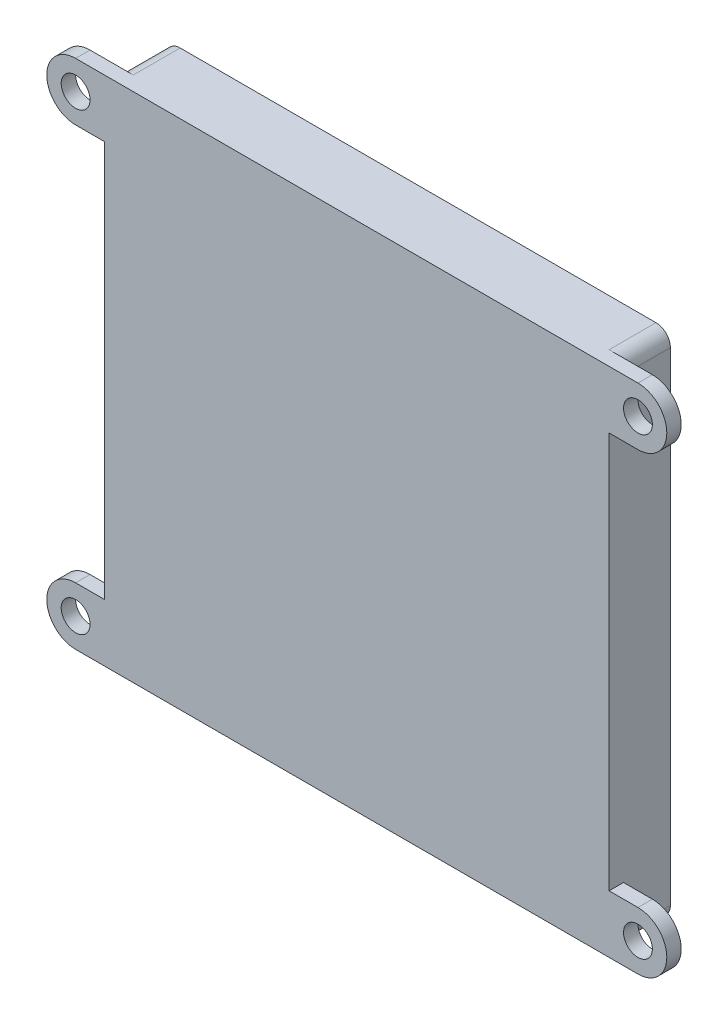
ISO-10303-21;
HEADER;
FILE_DESCRIPTION(('STEP AP214'),'2;1');
FILE_NAME('part.step','',(''),(''),'','','');
FILE_SCHEMA(('AUTOMOTIVE_DESIGN { 1 0 10303 214 1 1 1 1 }'));
ENDSEC;
DATA;
#1=APPLICATION_CONTEXT('core data for automotive mechanical design processes');
#2=APPLICATION_PROTOCOL_DEFINITION('international standard','automotive_design',2000,#1);
#3=PRODUCT_CONTEXT('',#1,'mechanical');
#4=PRODUCT('Part','Part','',(#3));
#5=PRODUCT_RELATED_PRODUCT_CATEGORY('part','',(#4));
#6=PRODUCT_DEFINITION_FORMATION('','',#4);
#7=PRODUCT_DEFINITION_CONTEXT('part definition',#1,'design');
#8=PRODUCT_DEFINITION('design','',#6,#7);
#9=PRODUCT_DEFINITION_SHAPE('','',#8);
#10=(LENGTH_UNIT() NAMED_UNIT(*) SI_UNIT(.MILLI.,.METRE.));
#11=(NAMED_UNIT(*) PLANE_ANGLE_UNIT() SI_UNIT($,.RADIAN.));
#12=(NAMED_UNIT(*) SI_UNIT($,.STERADIAN.) SOLID_ANGLE_UNIT());
#13=UNCERTAINTY_MEASURE_WITH_UNIT(LENGTH_MEASURE(1.E-05),#10,'distance_accuracy_value','');
#14=(GEOMETRIC_REPRESENTATION_CONTEXT(3) GLOBAL_UNCERTAINTY_ASSIGNED_CONTEXT((#13)) GLOBAL_UNIT_ASSIGNED_CONTEXT((#10,
#11,#12)) REPRESENTATION_CONTEXT('',''));
#15=CARTESIAN_POINT('',(0.,0.,0.));
#16=DIRECTION('',(0.,0.,1.));
#17=DIRECTION('',(1.,0.,0.));
#18=AXIS2_PLACEMENT_3D('',#15,#16,#17);
#19=CARTESIAN_POINT('',(0.,0.,0.));
#20=DIRECTION('',(0.,0.,1.));
#21=DIRECTION('',(1.,0.,0.));
#22=AXIS2_PLACEMENT_3D('',#19,#20,#21);
#23=PLANE('',#22);
#24=CARTESIAN_POINT('',(39.,-31.5,0.));
#25=DIRECTION('',(0.,0.,1.));
#26=DIRECTION('',(1.,0.,0.));
#27=AXIS2_PLACEMENT_3D('',#24,#25,#26);
#28=CIRCLE('',#27,2.);
#29=CARTESIAN_POINT('',(41.,-31.5,0.));
#30=VERTEX_POINT('',#29);
#31=EDGE_CURVE('E214',#30,#30,#28,.F.);
#32=ORIENTED_EDGE('',*,*,#31,.F.);
#33=EDGE_LOOP('',(#32));
#34=FACE_BOUND('',#33,.T.);
#35=DIRECTION('',(1.,0.,0.));
#36=VECTOR('',#35,1.);
#37=CARTESIAN_POINT('',(0.,-35.5,0.));
#38=LINE('',#37,#36);
#39=CARTESIAN_POINT('',(33.,-35.5,0.));
#40=VERTEX_POINT('',#39);
#41=CARTESIAN_POINT('',(39.,-35.5,0.));
#42=VERTEX_POINT('',#41);
#43=EDGE_CURVE('E230',#40,#42,#38,.T.);
#44=ORIENTED_EDGE('',*,*,#43,.F.);
#45=CARTESIAN_POINT('',(33.,-33.5,0.));
#46=DIRECTION('',(0.,0.,1.));
#47=DIRECTION('',(1.,0.,0.));
#48=AXIS2_PLACEMENT_3D('',#45,#46,#47);
#49=CIRCLE('',#48,2.);
#50=CARTESIAN_POINT('',(35.,-33.5,0.));
#51=VERTEX_POINT('',#50);
#52=EDGE_CURVE('E185',#40,#51,#49,.T.);
#53=ORIENTED_EDGE('',*,*,#52,.T.);
#54=DIRECTION('',(0.,1.,0.));
#55=VECTOR('',#54,1.);
#56=CARTESIAN_POINT('',(35.,35.5,0.));
#57=LINE('',#56,#55);
#58=CARTESIAN_POINT('',(35.,-27.5,0.));
#59=VERTEX_POINT('',#58);
#60=EDGE_CURVE('E179',#51,#59,#57,.T.);
#61=ORIENTED_EDGE('',*,*,#60,.T.);
#62=DIRECTION('',(1.,0.,0.));
#63=VECTOR('',#62,1.);
#64=CARTESIAN_POINT('',(0.,-27.5,0.));
#65=LINE('',#64,#63);
#66=CARTESIAN_POINT('',(39.,-27.5,0.));
#67=VERTEX_POINT('',#66);
#68=EDGE_CURVE('E183',#59,#67,#65,.T.);
#69=ORIENTED_EDGE('',*,*,#68,.T.);
#70=CARTESIAN_POINT('',(39.,-31.5,0.));
#71=DIRECTION('',(0.,0.,1.));
#72=DIRECTION('',(1.,0.,0.));
#73=AXIS2_PLACEMENT_3D('',#70,#71,#72);
#74=CIRCLE('',#73,4.);
#75=EDGE_CURVE('E208',#67,#42,#74,.F.);
#76=ORIENTED_EDGE('',*,*,#75,.T.);
#77=EDGE_LOOP('',(#44,#53,#61,#69,#76));
#78=FACE_BOUND('',#77,.T.);
#79=ADVANCED_FACE('F41',(#34,#78),#23,.F.);
#80=CARTESIAN_POINT('',(39.,31.5,0.));
#81=DIRECTION('',(0.,0.,1.));
#82=DIRECTION('',(1.,0.,0.));
#83=AXIS2_PLACEMENT_3D('',#80,#81,#82);
#84=CIRCLE('',#83,2.);
#85=CARTESIAN_POINT('',(41.,31.5,0.));
#86=VERTEX_POINT('',#85);
#87=EDGE_CURVE('E274',#86,#86,#84,.T.);
#88=ORIENTED_EDGE('',*,*,#87,.T.);
#89=EDGE_LOOP('',(#88));
#90=FACE_BOUND('',#89,.T.);
#91=DIRECTION('',(1.,0.,0.));
#92=VECTOR('',#91,1.);
#93=CARTESIAN_POINT('',(0.,27.5,0.));
#94=LINE('',#93,#92);
#95=CARTESIAN_POINT('',(35.,27.5,0.));
#96=VERTEX_POINT('',#95);
#97=CARTESIAN_POINT('',(39.,27.5,0.));
#98=VERTEX_POINT('',#97);
#99=EDGE_CURVE('E234',#96,#98,#94,.T.);
#100=ORIENTED_EDGE('',*,*,#99,.F.);
#101=CARTESIAN_POINT('',(35.,33.5,0.));
#102=VERTEX_POINT('',#101);
#103=EDGE_CURVE('E191',#96,#102,#57,.T.);
#104=ORIENTED_EDGE('',*,*,#103,.T.);
#105=CARTESIAN_POINT('',(33.,33.5,0.));
#106=DIRECTION('',(0.,0.,1.));
#107=DIRECTION('',(1.,0.,0.));
#108=AXIS2_PLACEMENT_3D('',#105,#106,#107);
#109=CIRCLE('',#108,2.);
#110=CARTESIAN_POINT('',(33.,35.5,0.));
#111=VERTEX_POINT('',#110);
#112=EDGE_CURVE('E11',#102,#111,#109,.T.);
#113=ORIENTED_EDGE('',*,*,#112,.T.);
#114=DIRECTION('',(1.,0.,0.));
#115=VECTOR('',#114,1.);
#116=CARTESIAN_POINT('',(0.,35.5,0.));
#117=LINE('',#116,#115);
#118=CARTESIAN_POINT('',(39.,35.5,0.));
#119=VERTEX_POINT('',#118);
#120=EDGE_CURVE('E65',#111,#119,#117,.T.);
#121=ORIENTED_EDGE('',*,*,#120,.T.);
#122=CARTESIAN_POINT('',(39.,31.5,0.));
#123=DIRECTION('',(0.,0.,1.));
#124=DIRECTION('',(1.,0.,0.));
#125=AXIS2_PLACEMENT_3D('',#122,#123,#124);
#126=CIRCLE('',#125,4.);
#127=EDGE_CURVE('E244',#98,#119,#126,.T.);
#128=ORIENTED_EDGE('',*,*,#127,.F.);
#129=EDGE_LOOP('',(#100,#104,#113,#121,#128));
#130=FACE_BOUND('',#129,.T.);
#131=ADVANCED_FACE('F341',(#90,#130),#23,.F.);
#132=CARTESIAN_POINT('',(-39.,31.5,0.));
#133=DIRECTION('',(0.,0.,1.));
#134=DIRECTION('',(1.,0.,0.));
#135=AXIS2_PLACEMENT_3D('',#132,#133,#134);
#136=CIRCLE('',#135,2.);
#137=CARTESIAN_POINT('',(-37.,31.5,0.));
#138=VERTEX_POINT('',#137);
#139=EDGE_CURVE('E525',#138,#138,#136,.T.);
#140=ORIENTED_EDGE('',*,*,#139,.T.);
#141=EDGE_LOOP('',(#140));
#142=FACE_BOUND('',#141,.T.);
#143=CARTESIAN_POINT('',(-39.,35.5,0.));
#144=VERTEX_POINT('',#143);
#145=CARTESIAN_POINT('',(-33.,35.5,0.));
#146=VERTEX_POINT('',#145);
#147=EDGE_CURVE('E57',#144,#146,#117,.T.);
#148=ORIENTED_EDGE('',*,*,#147,.T.);
#149=CARTESIAN_POINT('',(-33.,33.5,0.));
#150=DIRECTION('',(0.,0.,1.));
#151=DIRECTION('',(1.,0.,0.));
#152=AXIS2_PLACEMENT_3D('',#149,#150,#151);
#153=CIRCLE('',#152,2.);
#154=CARTESIAN_POINT('',(-35.,33.5,0.));
#155=VERTEX_POINT('',#154);
#156=EDGE_CURVE('E50',#146,#155,#153,.T.);
#157=ORIENTED_EDGE('',*,*,#156,.T.);
#158=DIRECTION('',(0.,-1.,0.));
#159=VECTOR('',#158,1.);
#160=CARTESIAN_POINT('',(-35.,35.5,0.));
#161=LINE('',#160,#159);
#162=CARTESIAN_POINT('',(-35.,27.5,0.));
#163=VERTEX_POINT('',#162);
#164=EDGE_CURVE('E189',#155,#163,#161,.T.);
#165=ORIENTED_EDGE('',*,*,#164,.T.);
#166=CARTESIAN_POINT('',(-39.,27.5,0.));
#167=VERTEX_POINT('',#166);
#168=EDGE_CURVE('E223',#167,#163,#94,.T.);
#169=ORIENTED_EDGE('',*,*,#168,.F.);
#170=CARTESIAN_POINT('',(-39.,31.5,0.));
#171=DIRECTION('',(0.,0.,1.));
#172=DIRECTION('',(1.,0.,0.));
#173=AXIS2_PLACEMENT_3D('',#170,#171,#172);
#174=CIRCLE('',#173,4.);
#175=EDGE_CURVE('E232',#144,#167,#174,.T.);
#176=ORIENTED_EDGE('',*,*,#175,.F.);
#177=EDGE_LOOP('',(#148,#157,#165,#169,#176));
#178=FACE_BOUND('',#177,.T.);
#179=ADVANCED_FACE('F336',(#142,#178),#23,.F.);
#180=CARTESIAN_POINT('',(35.,0.,2.));
#181=DIRECTION('',(1.,0.,0.));
#182=DIRECTION('',(0.,0.,-1.));
#183=AXIS2_PLACEMENT_3D('',#180,#181,#182);
#184=PLANE('',#183);
#185=ORIENTED_EDGE('',*,*,#60,.F.);
#186=DIRECTION('',(0.,0.,1.));
#187=VECTOR('',#186,1.);
#188=CARTESIAN_POINT('',(35.,-33.5,-6.5));
#189=LINE('',#188,#187);
#190=CARTESIAN_POINT('',(35.,-33.5,-6.5));
#191=VERTEX_POINT('',#190);
#192=EDGE_CURVE('E429',#51,#191,#189,.F.);
#193=ORIENTED_EDGE('',*,*,#192,.T.);
#194=DIRECTION('',(0.,1.,0.));
#195=VECTOR('',#194,1.);
#196=CARTESIAN_POINT('',(35.,35.5,-6.5));
#197=LINE('',#196,#195);
#198=CARTESIAN_POINT('',(35.,33.5,-6.5));
#199=VERTEX_POINT('',#198);
#200=EDGE_CURVE('E269',#191,#199,#197,.T.);
#201=ORIENTED_EDGE('',*,*,#200,.T.);
#202=DIRECTION('',(0.,0.,1.));
#203=VECTOR('',#202,1.);
#204=CARTESIAN_POINT('',(35.,33.5,2.));
#205=LINE('',#204,#203);
#206=EDGE_CURVE('E487',#199,#102,#205,.T.);
#207=ORIENTED_EDGE('',*,*,#206,.T.);
#208=ORIENTED_EDGE('',*,*,#103,.F.);
#209=DIRECTION('',(0.,0.,-1.));
#210=VECTOR('',#209,1.);
#211=CARTESIAN_POINT('',(35.,27.5,2.));
#212=LINE('',#211,#210);
#213=CARTESIAN_POINT('',(35.,27.5,2.));
#214=VERTEX_POINT('',#213);
#215=EDGE_CURVE('E478',#214,#96,#212,.T.);
#216=ORIENTED_EDGE('',*,*,#215,.F.);
#217=DIRECTION('',(0.,-1.,0.));
#218=VECTOR('',#217,1.);
#219=CARTESIAN_POINT('',(35.,0.,2.));
#220=LINE('',#219,#218);
#221=CARTESIAN_POINT('',(35.,-27.5,2.));
#222=VERTEX_POINT('',#221);
#223=EDGE_CURVE('E196',#214,#222,#220,.T.);
#224=ORIENTED_EDGE('',*,*,#223,.T.);
#225=DIRECTION('',(0.,0.,-1.));
#226=VECTOR('',#225,1.);
#227=CARTESIAN_POINT('',(35.,-27.5,2.));
#228=LINE('',#227,#226);
#229=EDGE_CURVE('E193',#222,#59,#228,.T.);
#230=ORIENTED_EDGE('',*,*,#229,.T.);
#231=EDGE_LOOP('',(#185,#193,#201,#207,#208,#216,#224,#230));
#232=FACE_BOUND('',#231,.T.);
#233=ADVANCED_FACE('F194',(#232),#184,.T.);
#234=CARTESIAN_POINT('',(0.,27.5,2.));
#235=DIRECTION('',(0.,1.,0.));
#236=DIRECTION('',(-1.,0.,0.));
#237=AXIS2_PLACEMENT_3D('',#234,#235,#236);
#238=PLANE('',#237);
#239=ORIENTED_EDGE('',*,*,#99,.T.);
#240=DIRECTION('',(0.,0.,-1.));
#241=VECTOR('',#240,1.);
#242=CARTESIAN_POINT('',(39.,27.5,2.));
#243=LINE('',#242,#241);
#244=CARTESIAN_POINT('',(39.,27.5,2.));
#245=VERTEX_POINT('',#244);
#246=EDGE_CURVE('E475',#245,#98,#243,.T.);
#247=ORIENTED_EDGE('',*,*,#246,.F.);
#248=DIRECTION('',(1.,0.,0.));
#249=VECTOR('',#248,1.);
#250=CARTESIAN_POINT('',(0.,27.5,2.));
#251=LINE('',#250,#249);
#252=EDGE_CURVE('E273',#214,#245,#251,.T.);
#253=ORIENTED_EDGE('',*,*,#252,.F.);
#254=ORIENTED_EDGE('',*,*,#215,.T.);
#255=EDGE_LOOP('',(#239,#247,#253,#254));
#256=FACE_BOUND('',#255,.T.);
#257=ADVANCED_FACE('F383',(#256),#238,.F.);
#258=CARTESIAN_POINT('',(39.,31.5,2.));
#259=DIRECTION('',(0.,0.,-1.));
#260=DIRECTION('',(-1.,0.,0.));
#261=AXIS2_PLACEMENT_3D('',#258,#259,#260);
#262=CYLINDRICAL_SURFACE('',#261,4.);
#263=ORIENTED_EDGE('',*,*,#127,.T.);
#264=DIRECTION('',(0.,0.,-1.));
#265=VECTOR('',#264,1.);
#266=CARTESIAN_POINT('',(39.,35.5,2.));
#267=LINE('',#266,#265);
#268=CARTESIAN_POINT('',(39.,35.5,2.));
#269=VERTEX_POINT('',#268);
#270=EDGE_CURVE('E472',#269,#119,#267,.T.);
#271=ORIENTED_EDGE('',*,*,#270,.F.);
#272=CARTESIAN_POINT('',(39.,31.5,2.));
#273=DIRECTION('',(0.,0.,1.));
#274=DIRECTION('',(1.,0.,0.));
#275=AXIS2_PLACEMENT_3D('',#272,#273,#274);
#276=CIRCLE('',#275,4.);
#277=EDGE_CURVE('E277',#245,#269,#276,.T.);
#278=ORIENTED_EDGE('',*,*,#277,.F.);
#279=ORIENTED_EDGE('',*,*,#246,.T.);
#280=EDGE_LOOP('',(#263,#271,#278,#279));
#281=FACE_BOUND('',#280,.T.);
#282=ADVANCED_FACE('F390',(#281),#262,.T.);
#283=CARTESIAN_POINT('',(0.,35.5,2.));
#284=DIRECTION('',(0.,1.,0.));
#285=DIRECTION('',(-1.,0.,0.));
#286=AXIS2_PLACEMENT_3D('',#283,#284,#285);
#287=PLANE('',#286);
#288=DIRECTION('',(-1.,0.,0.));
#289=VECTOR('',#288,1.);
#290=CARTESIAN_POINT('',(-35.,35.5,-6.5));
#291=LINE('',#290,#289);
#292=CARTESIAN_POINT('',(33.,35.5,-6.5));
#293=VERTEX_POINT('',#292);
#294=CARTESIAN_POINT('',(-33.,35.5,-6.5));
#295=VERTEX_POINT('',#294);
#296=EDGE_CURVE('E263',#293,#295,#291,.T.);
#297=ORIENTED_EDGE('',*,*,#296,.T.);
#298=DIRECTION('',(0.,0.,1.));
#299=VECTOR('',#298,1.);
#300=CARTESIAN_POINT('',(-33.,35.5,0.));
#301=LINE('',#300,#299);
#302=EDGE_CURVE('E416',#295,#146,#301,.T.);
#303=ORIENTED_EDGE('',*,*,#302,.T.);
#304=ORIENTED_EDGE('',*,*,#147,.F.);
#305=DIRECTION('',(0.,0.,-1.));
#306=VECTOR('',#305,1.);
#307=CARTESIAN_POINT('',(-39.,35.5,2.));
#308=LINE('',#307,#306);
#309=CARTESIAN_POINT('',(-39.,35.5,2.));
#310=VERTEX_POINT('',#309);
#311=EDGE_CURVE('E463',#310,#144,#308,.T.);
#312=ORIENTED_EDGE('',*,*,#311,.F.);
#313=DIRECTION('',(1.,0.,0.));
#314=VECTOR('',#313,1.);
#315=CARTESIAN_POINT('',(0.,35.5,2.));
#316=LINE('',#315,#314);
#317=EDGE_CURVE('E281',#310,#269,#316,.T.);
#318=ORIENTED_EDGE('',*,*,#317,.T.);
#319=ORIENTED_EDGE('',*,*,#270,.T.);
#320=ORIENTED_EDGE('',*,*,#120,.F.);
#321=DIRECTION('',(0.,0.,1.));
#322=VECTOR('',#321,1.);
#323=CARTESIAN_POINT('',(33.,35.5,2.));
#324=LINE('',#323,#322);
#325=EDGE_CURVE('E441',#111,#293,#324,.F.);
#326=ORIENTED_EDGE('',*,*,#325,.T.);
#327=EDGE_LOOP('',(#297,#303,#304,#312,#318,#319,#320,#326));
#328=FACE_BOUND('',#327,.T.);
#329=ADVANCED_FACE('F386',(#328),#287,.T.);
#330=CARTESIAN_POINT('',(-39.,31.5,2.));
#331=DIRECTION('',(0.,0.,-1.));
#332=DIRECTION('',(-1.,0.,0.));
#333=AXIS2_PLACEMENT_3D('',#330,#331,#332);
#334=CYLINDRICAL_SURFACE('',#333,4.);
#335=ORIENTED_EDGE('',*,*,#175,.T.);
#336=DIRECTION('',(0.,0.,-1.));
#337=VECTOR('',#336,1.);
#338=CARTESIAN_POINT('',(-39.,27.5,2.));
#339=LINE('',#338,#337);
#340=CARTESIAN_POINT('',(-39.,27.5,2.));
#341=VERTEX_POINT('',#340);
#342=EDGE_CURVE('E458',#341,#167,#339,.T.);
#343=ORIENTED_EDGE('',*,*,#342,.F.);
#344=CARTESIAN_POINT('',(-39.,31.5,2.));
#345=DIRECTION('',(0.,0.,1.));
#346=DIRECTION('',(1.,0.,0.));
#347=AXIS2_PLACEMENT_3D('',#344,#345,#346);
#348=CIRCLE('',#347,4.);
#349=EDGE_CURVE('E285',#310,#341,#348,.T.);
#350=ORIENTED_EDGE('',*,*,#349,.F.);
#351=ORIENTED_EDGE('',*,*,#311,.T.);
#352=EDGE_LOOP('',(#335,#343,#350,#351));
#353=FACE_BOUND('',#352,.T.);
#354=ADVANCED_FACE('F382',(#353),#334,.T.);
#355=ORIENTED_EDGE('',*,*,#168,.T.);
#356=DIRECTION('',(0.,0.,-1.));
#357=VECTOR('',#356,1.);
#358=CARTESIAN_POINT('',(-35.,27.5,2.));
#359=LINE('',#358,#357);
#360=CARTESIAN_POINT('',(-35.,27.5,2.));
#361=VERTEX_POINT('',#360);
#362=EDGE_CURVE('E454',#361,#163,#359,.T.);
#363=ORIENTED_EDGE('',*,*,#362,.F.);
#364=EDGE_CURVE('E278',#341,#361,#251,.T.);
#365=ORIENTED_EDGE('',*,*,#364,.F.);
#366=ORIENTED_EDGE('',*,*,#342,.T.);
#367=EDGE_LOOP('',(#355,#363,#365,#366));
#368=FACE_BOUND('',#367,.T.);
#369=ADVANCED_FACE('F378',(#368),#238,.F.);
#370=CARTESIAN_POINT('',(-35.,0.,2.));
#371=DIRECTION('',(1.,0.,0.));
#372=DIRECTION('',(0.,0.,-1.));
#373=AXIS2_PLACEMENT_3D('',#370,#371,#372);
#374=PLANE('',#373);
#375=DIRECTION('',(0.,-1.,0.));
#376=VECTOR('',#375,1.);
#377=CARTESIAN_POINT('',(-35.,35.5,-6.5));
#378=LINE('',#377,#376);
#379=CARTESIAN_POINT('',(-35.,33.5,-6.5));
#380=VERTEX_POINT('',#379);
#381=CARTESIAN_POINT('',(-35.,-33.5,-6.5));
#382=VERTEX_POINT('',#381);
#383=EDGE_CURVE('E255',#380,#382,#378,.T.);
#384=ORIENTED_EDGE('',*,*,#383,.T.);
#385=DIRECTION('',(0.,0.,1.));
#386=VECTOR('',#385,1.);
#387=CARTESIAN_POINT('',(-35.,-33.5,2.));
#388=LINE('',#387,#386);
#389=CARTESIAN_POINT('',(-35.,-33.5,0.));
#390=VERTEX_POINT('',#389);
#391=EDGE_CURVE('E437',#382,#390,#388,.T.);
#392=ORIENTED_EDGE('',*,*,#391,.T.);
#393=CARTESIAN_POINT('',(-35.,-27.5,0.));
#394=VERTEX_POINT('',#393);
#395=EDGE_CURVE('E270',#394,#390,#161,.T.);
#396=ORIENTED_EDGE('',*,*,#395,.F.);
#397=DIRECTION('',(0.,0.,-1.));
#398=VECTOR('',#397,1.);
#399=CARTESIAN_POINT('',(-35.,-27.5,2.));
#400=LINE('',#399,#398);
#401=CARTESIAN_POINT('',(-35.,-27.5,2.));
#402=VERTEX_POINT('',#401);
#403=EDGE_CURVE('E459',#402,#394,#400,.T.);
#404=ORIENTED_EDGE('',*,*,#403,.F.);
#405=DIRECTION('',(0.,-1.,0.));
#406=VECTOR('',#405,1.);
#407=CARTESIAN_POINT('',(-35.,0.,2.));
#408=LINE('',#407,#406);
#409=EDGE_CURVE('E288',#361,#402,#408,.T.);
#410=ORIENTED_EDGE('',*,*,#409,.F.);
#411=ORIENTED_EDGE('',*,*,#362,.T.);
#412=ORIENTED_EDGE('',*,*,#164,.F.);
#413=DIRECTION('',(0.,0.,1.));
#414=VECTOR('',#413,1.);
#415=CARTESIAN_POINT('',(-35.,33.5,-6.5));
#416=LINE('',#415,#414);
#417=EDGE_CURVE('E414',#155,#380,#416,.F.);
#418=ORIENTED_EDGE('',*,*,#417,.T.);
#419=EDGE_LOOP('',(#384,#392,#396,#404,#410,#411,#412,#418));
#420=FACE_BOUND('',#419,.T.);
#421=ADVANCED_FACE('F375',(#420),#374,.F.);
#422=CARTESIAN_POINT('',(0.,-27.5,2.));
#423=DIRECTION('',(0.,1.,0.));
#424=DIRECTION('',(-1.,0.,0.));
#425=AXIS2_PLACEMENT_3D('',#422,#423,#424);
#426=PLANE('',#425);
#427=CARTESIAN_POINT('',(-39.,-27.5,0.));
#428=VERTEX_POINT('',#427);
#429=EDGE_CURVE('E210',#428,#394,#65,.T.);
#430=ORIENTED_EDGE('',*,*,#429,.F.);
#431=DIRECTION('',(0.,0.,-1.));
#432=VECTOR('',#431,1.);
#433=CARTESIAN_POINT('',(-39.,-27.5,2.));
#434=LINE('',#433,#432);
#435=CARTESIAN_POINT('',(-39.,-27.5,2.));
#436=VERTEX_POINT('',#435);
#437=EDGE_CURVE('E466',#436,#428,#434,.T.);
#438=ORIENTED_EDGE('',*,*,#437,.F.);
#439=DIRECTION('',(1.,0.,0.));
#440=VECTOR('',#439,1.);
#441=CARTESIAN_POINT('',(0.,-27.5,2.));
#442=LINE('',#441,#440);
#443=EDGE_CURVE('E291',#436,#402,#442,.T.);
#444=ORIENTED_EDGE('',*,*,#443,.T.);
#445=ORIENTED_EDGE('',*,*,#403,.T.);
#446=EDGE_LOOP('',(#430,#438,#444,#445));
#447=FACE_BOUND('',#446,.T.);
#448=ADVANCED_FACE('F364',(#447),#426,.T.);
#449=CARTESIAN_POINT('',(-39.,-31.5,2.));
#450=DIRECTION('',(0.,0.,-1.));
#451=DIRECTION('',(-1.,0.,0.));
#452=AXIS2_PLACEMENT_3D('',#449,#450,#451);
#453=CYLINDRICAL_SURFACE('',#452,4.);
#454=CARTESIAN_POINT('',(-39.,-31.5,0.));
#455=DIRECTION('',(0.,0.,1.));
#456=DIRECTION('',(1.,0.,0.));
#457=AXIS2_PLACEMENT_3D('',#454,#455,#456);
#458=CIRCLE('',#457,4.);
#459=CARTESIAN_POINT('',(-39.,-35.5,0.));
#460=VERTEX_POINT('',#459);
#461=EDGE_CURVE('E222',#460,#428,#458,.F.);
#462=ORIENTED_EDGE('',*,*,#461,.F.);
#463=DIRECTION('',(0.,0.,-1.));
#464=VECTOR('',#463,1.);
#465=CARTESIAN_POINT('',(-39.,-35.5,2.));
#466=LINE('',#465,#464);
#467=CARTESIAN_POINT('',(-39.,-35.5,2.));
#468=VERTEX_POINT('',#467);
#469=EDGE_CURVE('E506',#468,#460,#466,.T.);
#470=ORIENTED_EDGE('',*,*,#469,.F.);
#471=CARTESIAN_POINT('',(-39.,-31.5,2.));
#472=DIRECTION('',(0.,0.,1.));
#473=DIRECTION('',(1.,0.,0.));
#474=AXIS2_PLACEMENT_3D('',#471,#472,#473);
#475=CIRCLE('',#474,4.);
#476=EDGE_CURVE('E295',#468,#436,#475,.F.);
#477=ORIENTED_EDGE('',*,*,#476,.T.);
#478=ORIENTED_EDGE('',*,*,#437,.T.);
#479=EDGE_LOOP('',(#462,#470,#477,#478));
#480=FACE_BOUND('',#479,.T.);
#481=ADVANCED_FACE('F371',(#480),#453,.T.);
#482=CARTESIAN_POINT('',(0.,-35.5,2.));
#483=DIRECTION('',(0.,1.,0.));
#484=DIRECTION('',(-1.,0.,0.));
#485=AXIS2_PLACEMENT_3D('',#482,#483,#484);
#486=PLANE('',#485);
#487=DIRECTION('',(1.,0.,0.));
#488=VECTOR('',#487,1.);
#489=CARTESIAN_POINT('',(-35.,-35.5,-6.5));
#490=LINE('',#489,#488);
#491=CARTESIAN_POINT('',(-33.,-35.5,-6.5));
#492=VERTEX_POINT('',#491);
#493=CARTESIAN_POINT('',(33.,-35.5,-6.5));
#494=VERTEX_POINT('',#493);
#495=EDGE_CURVE('E245',#492,#494,#490,.T.);
#496=ORIENTED_EDGE('',*,*,#495,.T.);
#497=DIRECTION('',(0.,0.,1.));
#498=VECTOR('',#497,1.);
#499=CARTESIAN_POINT('',(33.,-35.5,0.));
#500=LINE('',#499,#498);
#501=EDGE_CURVE('E484',#494,#40,#500,.T.);
#502=ORIENTED_EDGE('',*,*,#501,.T.);
#503=ORIENTED_EDGE('',*,*,#43,.T.);
#504=DIRECTION('',(0.,0.,-1.));
#505=VECTOR('',#504,1.);
#506=CARTESIAN_POINT('',(39.,-35.5,2.));
#507=LINE('',#506,#505);
#508=CARTESIAN_POINT('',(39.,-35.5,2.));
#509=VERTEX_POINT('',#508);
#510=EDGE_CURVE('E501',#509,#42,#507,.T.);
#511=ORIENTED_EDGE('',*,*,#510,.F.);
#512=DIRECTION('',(1.,0.,0.));
#513=VECTOR('',#512,1.);
#514=CARTESIAN_POINT('',(0.,-35.5,2.));
#515=LINE('',#514,#513);
#516=EDGE_CURVE('E300',#468,#509,#515,.T.);
#517=ORIENTED_EDGE('',*,*,#516,.F.);
#518=ORIENTED_EDGE('',*,*,#469,.T.);
#519=CARTESIAN_POINT('',(-33.,-35.5,0.));
#520=VERTEX_POINT('',#519);
#521=EDGE_CURVE('E216',#460,#520,#38,.T.);
#522=ORIENTED_EDGE('',*,*,#521,.T.);
#523=DIRECTION('',(0.,0.,1.));
#524=VECTOR('',#523,1.);
#525=CARTESIAN_POINT('',(-33.,-35.5,2.));
#526=LINE('',#525,#524);
#527=EDGE_CURVE('E481',#520,#492,#526,.F.);
#528=ORIENTED_EDGE('',*,*,#527,.T.);
#529=EDGE_LOOP('',(#496,#502,#503,#511,#517,#518,#522,#528));
#530=FACE_BOUND('',#529,.T.);
#531=ADVANCED_FACE('F367',(#530),#486,.F.);
#532=CARTESIAN_POINT('',(39.,-31.5,2.));
#533=DIRECTION('',(0.,0.,-1.));
#534=DIRECTION('',(-1.,0.,0.));
#535=AXIS2_PLACEMENT_3D('',#532,#533,#534);
#536=CYLINDRICAL_SURFACE('',#535,4.);
#537=ORIENTED_EDGE('',*,*,#75,.F.);
#538=DIRECTION('',(0.,0.,-1.));
#539=VECTOR('',#538,1.);
#540=CARTESIAN_POINT('',(39.,-27.5,2.));
#541=LINE('',#540,#539);
#542=CARTESIAN_POINT('',(39.,-27.5,2.));
#543=VERTEX_POINT('',#542);
#544=EDGE_CURVE('E201',#543,#67,#541,.T.);
#545=ORIENTED_EDGE('',*,*,#544,.F.);
#546=CARTESIAN_POINT('',(39.,-31.5,2.));
#547=DIRECTION('',(0.,0.,1.));
#548=DIRECTION('',(1.,0.,0.));
#549=AXIS2_PLACEMENT_3D('',#546,#547,#548);
#550=CIRCLE('',#549,4.);
#551=EDGE_CURVE('E303',#543,#509,#550,.F.);
#552=ORIENTED_EDGE('',*,*,#551,.T.);
#553=ORIENTED_EDGE('',*,*,#510,.T.);
#554=EDGE_LOOP('',(#537,#545,#552,#553));
#555=FACE_BOUND('',#554,.T.);
#556=ADVANCED_FACE('F353',(#555),#536,.T.);
#557=CARTESIAN_POINT('',(-39.,31.5,2.));
#558=DIRECTION('',(0.,0.,-1.));
#559=DIRECTION('',(-1.,0.,0.));
#560=AXIS2_PLACEMENT_3D('',#557,#558,#559);
#561=CYLINDRICAL_SURFACE('',#560,2.);
#562=CARTESIAN_POINT('',(-39.,31.5,2.));
#563=DIRECTION('',(0.,0.,1.));
#564=DIRECTION('',(1.,0.,0.));
#565=AXIS2_PLACEMENT_3D('',#562,#563,#564);
#566=CIRCLE('',#565,2.);
#567=CARTESIAN_POINT('',(-37.,31.5,2.));
#568=VERTEX_POINT('',#567);
#569=EDGE_CURVE('E315',#568,#568,#566,.T.);
#570=ORIENTED_EDGE('',*,*,#569,.T.);
#571=EDGE_LOOP('',(#570));
#572=FACE_BOUND('',#571,.T.);
#573=ORIENTED_EDGE('',*,*,#139,.F.);
#574=EDGE_LOOP('',(#573));
#575=FACE_BOUND('',#574,.T.);
#576=ADVANCED_FACE('F349',(#572,#575),#561,.F.);
#577=CARTESIAN_POINT('',(39.,-31.5,2.));
#578=DIRECTION('',(0.,0.,-1.));
#579=DIRECTION('',(-1.,0.,0.));
#580=AXIS2_PLACEMENT_3D('',#577,#578,#579);
#581=CYLINDRICAL_SURFACE('',#580,2.);
#582=CARTESIAN_POINT('',(39.,-31.5,2.));
#583=DIRECTION('',(0.,0.,1.));
#584=DIRECTION('',(1.,0.,0.));
#585=AXIS2_PLACEMENT_3D('',#582,#583,#584);
#586=CIRCLE('',#585,2.);
#587=CARTESIAN_POINT('',(41.,-31.5,2.));
#588=VERTEX_POINT('',#587);
#589=EDGE_CURVE('E311',#588,#588,#586,.F.);
#590=ORIENTED_EDGE('',*,*,#589,.F.);
#591=EDGE_LOOP('',(#590));
#592=FACE_BOUND('',#591,.T.);
#593=ORIENTED_EDGE('',*,*,#31,.T.);
#594=EDGE_LOOP('',(#593));
#595=FACE_BOUND('',#594,.T.);
#596=ADVANCED_FACE('F352',(#592,#595),#581,.F.);
#597=CARTESIAN_POINT('',(-39.,-31.5,2.));
#598=DIRECTION('',(0.,0.,-1.));
#599=DIRECTION('',(-1.,0.,0.));
#600=AXIS2_PLACEMENT_3D('',#597,#598,#599);
#601=CYLINDRICAL_SURFACE('',#600,2.);
#602=CARTESIAN_POINT('',(-39.,-31.5,2.));
#603=DIRECTION('',(0.,0.,1.));
#604=DIRECTION('',(1.,0.,0.));
#605=AXIS2_PLACEMENT_3D('',#602,#603,#604);
#606=CIRCLE('',#605,2.);
#607=CARTESIAN_POINT('',(-37.,-31.5,2.));
#608=VERTEX_POINT('',#607);
#609=EDGE_CURVE('E307',#608,#608,#606,.F.);
#610=ORIENTED_EDGE('',*,*,#609,.F.);
#611=EDGE_LOOP('',(#610));
#612=FACE_BOUND('',#611,.T.);
#613=CARTESIAN_POINT('',(-39.,-31.5,0.));
#614=DIRECTION('',(0.,0.,1.));
#615=DIRECTION('',(1.,0.,0.));
#616=AXIS2_PLACEMENT_3D('',#613,#614,#615);
#617=CIRCLE('',#616,2.);
#618=CARTESIAN_POINT('',(-37.,-31.5,0.));
#619=VERTEX_POINT('',#618);
#620=EDGE_CURVE('E207',#619,#619,#617,.F.);
#621=ORIENTED_EDGE('',*,*,#620,.T.);
#622=EDGE_LOOP('',(#621));
#623=FACE_BOUND('',#622,.T.);
#624=ADVANCED_FACE('F357',(#612,#623),#601,.F.);
#625=ORIENTED_EDGE('',*,*,#68,.F.);
#626=ORIENTED_EDGE('',*,*,#229,.F.);
#627=EDGE_CURVE('E296',#222,#543,#442,.T.);
#628=ORIENTED_EDGE('',*,*,#627,.T.);
#629=ORIENTED_EDGE('',*,*,#544,.T.);
#630=EDGE_LOOP('',(#625,#626,#628,#629));
#631=FACE_BOUND('',#630,.T.);
#632=ADVANCED_FACE('F204',(#631),#426,.T.);
#633=CARTESIAN_POINT('',(39.,31.5,2.));
#634=DIRECTION('',(0.,0.,-1.));
#635=DIRECTION('',(-1.,0.,0.));
#636=AXIS2_PLACEMENT_3D('',#633,#634,#635);
#637=CYLINDRICAL_SURFACE('',#636,2.);
#638=CARTESIAN_POINT('',(39.,31.5,2.));
#639=DIRECTION('',(0.,0.,1.));
#640=DIRECTION('',(1.,0.,0.));
#641=AXIS2_PLACEMENT_3D('',#638,#639,#640);
#642=CIRCLE('',#641,2.);
#643=CARTESIAN_POINT('',(41.,31.5,2.));
#644=VERTEX_POINT('',#643);
#645=EDGE_CURVE('E202',#644,#644,#642,.T.);
#646=ORIENTED_EDGE('',*,*,#645,.T.);
#647=EDGE_LOOP('',(#646));
#648=FACE_BOUND('',#647,.T.);
#649=ORIENTED_EDGE('',*,*,#87,.F.);
#650=EDGE_LOOP('',(#649));
#651=FACE_BOUND('',#650,.T.);
#652=ADVANCED_FACE('F322',(#648,#651),#637,.F.);
#653=CARTESIAN_POINT('',(0.,0.,2.));
#654=DIRECTION('',(0.,0.,1.));
#655=DIRECTION('',(1.,0.,0.));
#656=AXIS2_PLACEMENT_3D('',#653,#654,#655);
#657=PLANE('',#656);
#658=ORIENTED_EDGE('',*,*,#223,.F.);
#659=ORIENTED_EDGE('',*,*,#252,.T.);
#660=ORIENTED_EDGE('',*,*,#277,.T.);
#661=ORIENTED_EDGE('',*,*,#317,.F.);
#662=ORIENTED_EDGE('',*,*,#349,.T.);
#663=ORIENTED_EDGE('',*,*,#364,.T.);
#664=ORIENTED_EDGE('',*,*,#409,.T.);
#665=ORIENTED_EDGE('',*,*,#443,.F.);
#666=ORIENTED_EDGE('',*,*,#476,.F.);
#667=ORIENTED_EDGE('',*,*,#516,.T.);
#668=ORIENTED_EDGE('',*,*,#551,.F.);
#669=ORIENTED_EDGE('',*,*,#627,.F.);
#670=EDGE_LOOP('',(#658,#659,#660,#661,#662,#663,#664,#665,#666,#667,#668,#669));
#671=FACE_BOUND('',#670,.T.);
#672=ORIENTED_EDGE('',*,*,#609,.T.);
#673=EDGE_LOOP('',(#672));
#674=FACE_BOUND('',#673,.T.);
#675=ORIENTED_EDGE('',*,*,#589,.T.);
#676=EDGE_LOOP('',(#675));
#677=FACE_BOUND('',#676,.T.);
#678=ORIENTED_EDGE('',*,*,#569,.F.);
#679=EDGE_LOOP('',(#678));
#680=FACE_BOUND('',#679,.T.);
#681=ORIENTED_EDGE('',*,*,#645,.F.);
#682=EDGE_LOOP('',(#681));
#683=FACE_BOUND('',#682,.T.);
#684=ADVANCED_FACE('F325',(#671,#674,#677,#680,#683),#657,.T.);
#685=ORIENTED_EDGE('',*,*,#429,.T.);
#686=ORIENTED_EDGE('',*,*,#395,.T.);
#687=CARTESIAN_POINT('',(-33.,-33.5,0.));
#688=DIRECTION('',(0.,0.,1.));
#689=DIRECTION('',(1.,0.,0.));
#690=AXIS2_PLACEMENT_3D('',#687,#688,#689);
#691=CIRCLE('',#690,2.);
#692=EDGE_CURVE('E448',#390,#520,#691,.T.);
#693=ORIENTED_EDGE('',*,*,#692,.T.);
#694=ORIENTED_EDGE('',*,*,#521,.F.);
#695=ORIENTED_EDGE('',*,*,#461,.T.);
#696=EDGE_LOOP('',(#685,#686,#693,#694,#695));
#697=FACE_BOUND('',#696,.T.);
#698=ORIENTED_EDGE('',*,*,#620,.F.);
#699=EDGE_LOOP('',(#698));
#700=FACE_BOUND('',#699,.T.);
#701=ADVANCED_FACE('F327',(#697,#700),#23,.F.);
#702=CARTESIAN_POINT('',(0.,0.,-6.5));
#703=DIRECTION('',(0.,0.,1.));
#704=DIRECTION('',(1.,0.,0.));
#705=AXIS2_PLACEMENT_3D('',#702,#703,#704);
#706=PLANE('',#705);
#707=ORIENTED_EDGE('',*,*,#200,.F.);
#708=CARTESIAN_POINT('',(33.,-33.5,-6.5));
#709=DIRECTION('',(0.,0.,1.));
#710=DIRECTION('',(1.,0.,0.));
#711=AXIS2_PLACEMENT_3D('',#708,#709,#710);
#712=CIRCLE('',#711,2.);
#713=EDGE_CURVE('E427',#191,#494,#712,.F.);
#714=ORIENTED_EDGE('',*,*,#713,.T.);
#715=ORIENTED_EDGE('',*,*,#495,.F.);
#716=CARTESIAN_POINT('',(-33.,-33.5,-6.5));
#717=DIRECTION('',(0.,0.,1.));
#718=DIRECTION('',(1.,0.,0.));
#719=AXIS2_PLACEMENT_3D('',#716,#717,#718);
#720=CIRCLE('',#719,2.);
#721=EDGE_CURVE('E422',#492,#382,#720,.F.);
#722=ORIENTED_EDGE('',*,*,#721,.T.);
#723=ORIENTED_EDGE('',*,*,#383,.F.);
#724=CARTESIAN_POINT('',(-33.,33.5,-6.5));
#725=DIRECTION('',(0.,0.,1.));
#726=DIRECTION('',(1.,0.,0.));
#727=AXIS2_PLACEMENT_3D('',#724,#725,#726);
#728=CIRCLE('',#727,2.);
#729=EDGE_CURVE('E413',#380,#295,#728,.F.);
#730=ORIENTED_EDGE('',*,*,#729,.T.);
#731=ORIENTED_EDGE('',*,*,#296,.F.);
#732=CARTESIAN_POINT('',(33.,33.5,-6.5));
#733=DIRECTION('',(0.,0.,1.));
#734=DIRECTION('',(1.,0.,0.));
#735=AXIS2_PLACEMENT_3D('',#732,#733,#734);
#736=CIRCLE('',#735,2.);
#737=EDGE_CURVE('E423',#293,#199,#736,.F.);
#738=ORIENTED_EDGE('',*,*,#737,.T.);
#739=EDGE_LOOP('',(#707,#714,#715,#722,#723,#730,#731,#738));
#740=FACE_BOUND('',#739,.T.);
#741=ADVANCED_FACE('F334',(#740),#706,.F.);
#742=CARTESIAN_POINT('',(33.,-33.5,2.));
#743=DIRECTION('',(0.,0.,-1.));
#744=DIRECTION('',(-1.,0.,0.));
#745=AXIS2_PLACEMENT_3D('',#742,#743,#744);
#746=CYLINDRICAL_SURFACE('',#745,2.);
#747=ORIENTED_EDGE('',*,*,#713,.F.);
#748=ORIENTED_EDGE('',*,*,#192,.F.);
#749=ORIENTED_EDGE('',*,*,#52,.F.);
#750=ORIENTED_EDGE('',*,*,#501,.F.);
#751=EDGE_LOOP('',(#747,#748,#749,#750));
#752=FACE_BOUND('',#751,.T.);
#753=ADVANCED_FACE('F396',(#752),#746,.T.);
#754=CARTESIAN_POINT('',(-33.,-33.5,2.));
#755=DIRECTION('',(0.,0.,1.));
#756=DIRECTION('',(1.,0.,0.));
#757=AXIS2_PLACEMENT_3D('',#754,#755,#756);
#758=CYLINDRICAL_SURFACE('',#757,2.);
#759=ORIENTED_EDGE('',*,*,#721,.F.);
#760=ORIENTED_EDGE('',*,*,#527,.F.);
#761=ORIENTED_EDGE('',*,*,#692,.F.);
#762=ORIENTED_EDGE('',*,*,#391,.F.);
#763=EDGE_LOOP('',(#759,#760,#761,#762));
#764=FACE_BOUND('',#763,.T.);
#765=ADVANCED_FACE('F399',(#764),#758,.T.);
#766=CARTESIAN_POINT('',(-33.,33.5,2.));
#767=DIRECTION('',(0.,0.,-1.));
#768=DIRECTION('',(-1.,0.,0.));
#769=AXIS2_PLACEMENT_3D('',#766,#767,#768);
#770=CYLINDRICAL_SURFACE('',#769,2.);
#771=ORIENTED_EDGE('',*,*,#729,.F.);
#772=ORIENTED_EDGE('',*,*,#417,.F.);
#773=ORIENTED_EDGE('',*,*,#156,.F.);
#774=ORIENTED_EDGE('',*,*,#302,.F.);
#775=EDGE_LOOP('',(#771,#772,#773,#774));
#776=FACE_BOUND('',#775,.T.);
#777=ADVANCED_FACE('F402',(#776),#770,.T.);
#778=CARTESIAN_POINT('',(33.,33.5,2.));
#779=DIRECTION('',(0.,0.,1.));
#780=DIRECTION('',(1.,0.,0.));
#781=AXIS2_PLACEMENT_3D('',#778,#779,#780);
#782=CYLINDRICAL_SURFACE('',#781,2.);
#783=ORIENTED_EDGE('',*,*,#737,.F.);
#784=ORIENTED_EDGE('',*,*,#325,.F.);
#785=ORIENTED_EDGE('',*,*,#112,.F.);
#786=ORIENTED_EDGE('',*,*,#206,.F.);
#787=EDGE_LOOP('',(#783,#784,#785,#786));
#788=FACE_BOUND('',#787,.T.);
#789=ADVANCED_FACE('F43',(#788),#782,.T.);
#790=CLOSED_SHELL('',(#79,#131,#179,#233,#257,#282,#329,#354,#369,#421,#448,#481,#531,#556,#576,
#596,#624,#632,#652,#684,#701,#741,#753,#765,#777,#789));
#791=MANIFOLD_SOLID_BREP('B2',#790);
#792=ADVANCED_BREP_SHAPE_REPRESENTATION('',(#18,#791),#14);
#793=SHAPE_DEFINITION_REPRESENTATION(#9,#792);
ENDSEC;
END-ISO-10303-21;
